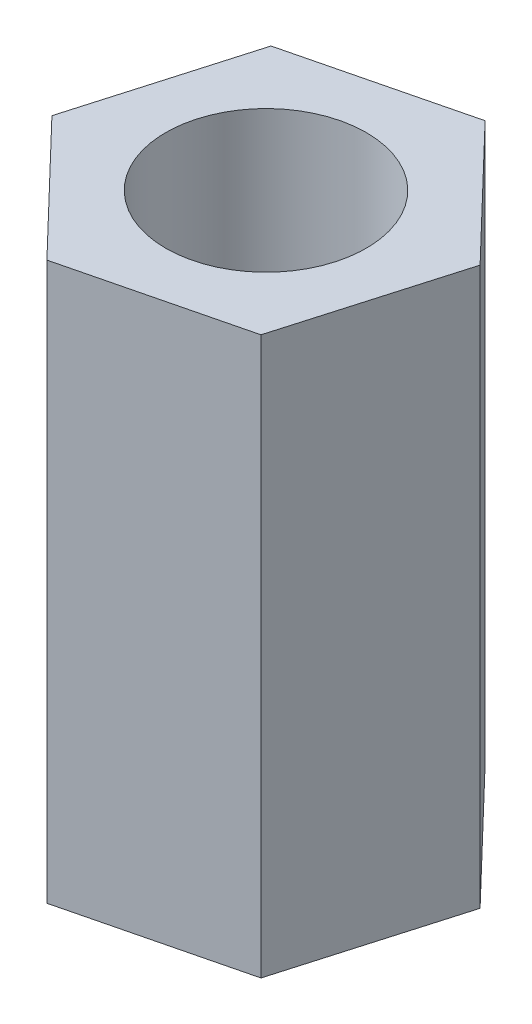
ISO-10303-21;
HEADER;
FILE_DESCRIPTION(('STEP AP214'),'2;1');
FILE_NAME('part.step','',(''),(''),'','','');
FILE_SCHEMA(('AUTOMOTIVE_DESIGN { 1 0 10303 214 1 1 1 1 }'));
ENDSEC;
DATA;
#1=APPLICATION_CONTEXT('core data for automotive mechanical design processes');
#2=APPLICATION_PROTOCOL_DEFINITION('international standard','automotive_design',2000,#1);
#3=PRODUCT_CONTEXT('',#1,'mechanical');
#4=PRODUCT('Part','Part','',(#3));
#5=PRODUCT_RELATED_PRODUCT_CATEGORY('part','',(#4));
#6=PRODUCT_DEFINITION_FORMATION('','',#4);
#7=PRODUCT_DEFINITION_CONTEXT('part definition',#1,'design');
#8=PRODUCT_DEFINITION('design','',#6,#7);
#9=PRODUCT_DEFINITION_SHAPE('','',#8);
#10=(LENGTH_UNIT() NAMED_UNIT(*) SI_UNIT(.MILLI.,.METRE.));
#11=(NAMED_UNIT(*) PLANE_ANGLE_UNIT() SI_UNIT($,.RADIAN.));
#12=(NAMED_UNIT(*) SI_UNIT($,.STERADIAN.) SOLID_ANGLE_UNIT());
#13=UNCERTAINTY_MEASURE_WITH_UNIT(LENGTH_MEASURE(1.E-05),#10,'distance_accuracy_value','');
#14=(GEOMETRIC_REPRESENTATION_CONTEXT(3) GLOBAL_UNCERTAINTY_ASSIGNED_CONTEXT((#13)) GLOBAL_UNIT_ASSIGNED_CONTEXT((#10,
#11,#12)) REPRESENTATION_CONTEXT('',''));
#15=CARTESIAN_POINT('',(0.,0.,0.));
#16=DIRECTION('',(0.,0.,1.));
#17=DIRECTION('',(1.,0.,0.));
#18=AXIS2_PLACEMENT_3D('',#15,#16,#17);
#19=CARTESIAN_POINT('',(0.,10.,0.));
#20=DIRECTION('',(0.,1.,0.));
#21=DIRECTION('',(0.,0.,1.));
#22=AXIS2_PLACEMENT_3D('',#19,#20,#21);
#23=PLANE('',#22);
#24=DIRECTION('',(0.970927267289887,0.,-0.239374688789339));
#25=VECTOR('',#24,1.);
#26=CARTESIAN_POINT('',(-0.883273683446069,10.,3.05010834782389));
#27=LINE('',#26,#25);
#28=CARTESIAN_POINT('',(-0.883273683446069,10.,3.05010834782389));
#29=VERTEX_POINT('',#28);
#30=CARTESIAN_POINT('',(2.19983447178743,10.,2.28999162227049));
#31=VERTEX_POINT('',#30);
#32=EDGE_CURVE('E129',#29,#31,#27,.T.);
#33=ORIENTED_EDGE('',*,*,#32,.T.);
#34=DIRECTION('',(0.278159072130381,0.,-0.960535023094715));
#35=VECTOR('',#34,1.);
#36=CARTESIAN_POINT('',(2.19983447178743,10.,2.28999162227049));
#37=LINE('',#36,#35);
#38=CARTESIAN_POINT('',(3.0831081552335,10.,-0.760116725553394));
#39=VERTEX_POINT('',#38);
#40=EDGE_CURVE('E87',#31,#39,#37,.T.);
#41=ORIENTED_EDGE('',*,*,#40,.T.);
#42=DIRECTION('',(-0.692768195159505,0.,-0.721160334305376));
#43=VECTOR('',#42,1.);
#44=CARTESIAN_POINT('',(3.0831081552335,10.,-0.760116725553394));
#45=LINE('',#44,#43);
#46=CARTESIAN_POINT('',(0.883273683446069,10.,-3.05010834782389));
#47=VERTEX_POINT('',#46);
#48=EDGE_CURVE('E100',#39,#47,#45,.T.);
#49=ORIENTED_EDGE('',*,*,#48,.T.);
#50=DIRECTION('',(-0.970927267289887,0.,0.239374688789339));
#51=VECTOR('',#50,1.);
#52=CARTESIAN_POINT('',(0.883273683446069,10.,-3.05010834782389));
#53=LINE('',#52,#51);
#54=CARTESIAN_POINT('',(-2.19983447178743,10.,-2.28999162227049));
#55=VERTEX_POINT('',#54);
#56=EDGE_CURVE('E94',#47,#55,#53,.T.);
#57=ORIENTED_EDGE('',*,*,#56,.T.);
#58=DIRECTION('',(-0.278159072130381,0.,0.960535023094715));
#59=VECTOR('',#58,1.);
#60=CARTESIAN_POINT('',(-2.19983447178743,10.,-2.28999162227049));
#61=LINE('',#60,#59);
#62=CARTESIAN_POINT('',(-3.0831081552335,10.,0.760116725553392));
#63=VERTEX_POINT('',#62);
#64=EDGE_CURVE('E98',#55,#63,#61,.T.);
#65=ORIENTED_EDGE('',*,*,#64,.T.);
#66=DIRECTION('',(0.692768195159505,0.,0.721160334305376));
#67=VECTOR('',#66,1.);
#68=CARTESIAN_POINT('',(-3.0831081552335,10.,0.760116725553392));
#69=LINE('',#68,#67);
#70=EDGE_CURVE('E50',#63,#29,#69,.T.);
#71=ORIENTED_EDGE('',*,*,#70,.T.);
#72=EDGE_LOOP('',(#33,#41,#49,#57,#65,#71));
#73=FACE_BOUND('',#72,.T.);
#74=CARTESIAN_POINT('',(0.,10.,0.));
#75=DIRECTION('',(0.,1.,0.));
#76=DIRECTION('',(0.,0.,1.));
#77=AXIS2_PLACEMENT_3D('',#74,#75,#76);
#78=CIRCLE('',#77,1.8);
#79=CARTESIAN_POINT('',(0.,10.,1.8));
#80=VERTEX_POINT('',#79);
#81=EDGE_CURVE('E122',#80,#80,#78,.T.);
#82=ORIENTED_EDGE('',*,*,#81,.F.);
#83=EDGE_LOOP('',(#82));
#84=FACE_BOUND('',#83,.T.);
#85=ADVANCED_FACE('F33',(#73,#84),#23,.T.);
#86=CARTESIAN_POINT('',(0.,0.,0.));
#87=DIRECTION('',(0.,1.,0.));
#88=DIRECTION('',(0.,0.,1.));
#89=AXIS2_PLACEMENT_3D('',#86,#87,#88);
#90=PLANE('',#89);
#91=DIRECTION('',(0.970927267289887,0.,-0.239374688789339));
#92=VECTOR('',#91,1.);
#93=CARTESIAN_POINT('',(-0.883273683446069,0.,3.05010834782389));
#94=LINE('',#93,#92);
#95=CARTESIAN_POINT('',(-0.883273683446069,0.,3.05010834782389));
#96=VERTEX_POINT('',#95);
#97=CARTESIAN_POINT('',(2.19983447178743,0.,2.28999162227049));
#98=VERTEX_POINT('',#97);
#99=EDGE_CURVE('E118',#96,#98,#94,.T.);
#100=ORIENTED_EDGE('',*,*,#99,.F.);
#101=DIRECTION('',(0.692768195159505,0.,0.721160334305376));
#102=VECTOR('',#101,1.);
#103=CARTESIAN_POINT('',(-3.0831081552335,0.,0.760116725553392));
#104=LINE('',#103,#102);
#105=CARTESIAN_POINT('',(-3.0831081552335,0.,0.760116725553392));
#106=VERTEX_POINT('',#105);
#107=EDGE_CURVE('E79',#106,#96,#104,.T.);
#108=ORIENTED_EDGE('',*,*,#107,.F.);
#109=DIRECTION('',(-0.278159072130381,0.,0.960535023094715));
#110=VECTOR('',#109,1.);
#111=CARTESIAN_POINT('',(-2.19983447178743,0.,-2.28999162227049));
#112=LINE('',#111,#110);
#113=CARTESIAN_POINT('',(-2.19983447178743,0.,-2.28999162227049));
#114=VERTEX_POINT('',#113);
#115=EDGE_CURVE('E73',#114,#106,#112,.T.);
#116=ORIENTED_EDGE('',*,*,#115,.F.);
#117=DIRECTION('',(-0.970927267289887,0.,0.239374688789339));
#118=VECTOR('',#117,1.);
#119=CARTESIAN_POINT('',(0.883273683446069,0.,-3.05010834782389));
#120=LINE('',#119,#118);
#121=CARTESIAN_POINT('',(0.883273683446069,0.,-3.05010834782389));
#122=VERTEX_POINT('',#121);
#123=EDGE_CURVE('E108',#122,#114,#120,.T.);
#124=ORIENTED_EDGE('',*,*,#123,.F.);
#125=DIRECTION('',(-0.692768195159505,0.,-0.721160334305376));
#126=VECTOR('',#125,1.);
#127=CARTESIAN_POINT('',(3.0831081552335,0.,-0.760116725553394));
#128=LINE('',#127,#126);
#129=CARTESIAN_POINT('',(3.0831081552335,0.,-0.760116725553394));
#130=VERTEX_POINT('',#129);
#131=EDGE_CURVE('E124',#130,#122,#128,.T.);
#132=ORIENTED_EDGE('',*,*,#131,.F.);
#133=DIRECTION('',(0.278159072130381,0.,-0.960535023094715));
#134=VECTOR('',#133,1.);
#135=CARTESIAN_POINT('',(2.19983447178743,0.,2.28999162227049));
#136=LINE('',#135,#134);
#137=EDGE_CURVE('E121',#98,#130,#136,.T.);
#138=ORIENTED_EDGE('',*,*,#137,.F.);
#139=EDGE_LOOP('',(#100,#108,#116,#124,#132,#138));
#140=FACE_BOUND('',#139,.T.);
#141=CARTESIAN_POINT('',(0.,0.,0.));
#142=DIRECTION('',(0.,1.,0.));
#143=DIRECTION('',(0.,0.,1.));
#144=AXIS2_PLACEMENT_3D('',#141,#142,#143);
#145=CIRCLE('',#144,1.8);
#146=CARTESIAN_POINT('',(0.,0.,1.8));
#147=VERTEX_POINT('',#146);
#148=EDGE_CURVE('E222',#147,#147,#145,.T.);
#149=ORIENTED_EDGE('',*,*,#148,.T.);
#150=EDGE_LOOP('',(#149));
#151=FACE_BOUND('',#150,.T.);
#152=ADVANCED_FACE('F138',(#140,#151),#90,.F.);
#153=CARTESIAN_POINT('',(-0.883273683446069,10.,3.05010834782389));
#154=DIRECTION('',(-0.239374688789339,0.,-0.970927267289887));
#155=DIRECTION('',(-0.970927267289887,0.,0.239374688789339));
#156=AXIS2_PLACEMENT_3D('',#153,#154,#155);
#157=PLANE('',#156);
#158=ORIENTED_EDGE('',*,*,#99,.T.);
#159=DIRECTION('',(0.,-1.,0.));
#160=VECTOR('',#159,1.);
#161=CARTESIAN_POINT('',(2.19983447178743,10.,2.28999162227049));
#162=LINE('',#161,#160);
#163=EDGE_CURVE('E11',#31,#98,#162,.T.);
#164=ORIENTED_EDGE('',*,*,#163,.F.);
#165=ORIENTED_EDGE('',*,*,#32,.F.);
#166=DIRECTION('',(0.,-1.,0.));
#167=VECTOR('',#166,1.);
#168=CARTESIAN_POINT('',(-0.883273683446069,10.,3.05010834782389));
#169=LINE('',#168,#167);
#170=EDGE_CURVE('E114',#29,#96,#169,.T.);
#171=ORIENTED_EDGE('',*,*,#170,.T.);
#172=EDGE_LOOP('',(#158,#164,#165,#171));
#173=FACE_BOUND('',#172,.T.);
#174=ADVANCED_FACE('F35',(#173),#157,.F.);
#175=CARTESIAN_POINT('',(2.19983447178743,10.,2.28999162227049));
#176=DIRECTION('',(-0.960535023094715,0.,-0.278159072130381));
#177=DIRECTION('',(-0.278159072130381,0.,0.960535023094715));
#178=AXIS2_PLACEMENT_3D('',#175,#176,#177);
#179=PLANE('',#178);
#180=ORIENTED_EDGE('',*,*,#137,.T.);
#181=DIRECTION('',(0.,-1.,0.));
#182=VECTOR('',#181,1.);
#183=CARTESIAN_POINT('',(3.0831081552335,10.,-0.760116725553394));
#184=LINE('',#183,#182);
#185=EDGE_CURVE('E42',#39,#130,#184,.T.);
#186=ORIENTED_EDGE('',*,*,#185,.F.);
#187=ORIENTED_EDGE('',*,*,#40,.F.);
#188=ORIENTED_EDGE('',*,*,#163,.T.);
#189=EDGE_LOOP('',(#180,#186,#187,#188));
#190=FACE_BOUND('',#189,.T.);
#191=ADVANCED_FACE('F163',(#190),#179,.F.);
#192=CARTESIAN_POINT('',(3.0831081552335,10.,-0.760116725553394));
#193=DIRECTION('',(-0.721160334305376,0.,0.692768195159505));
#194=DIRECTION('',(0.692768195159505,0.,0.721160334305376));
#195=AXIS2_PLACEMENT_3D('',#192,#193,#194);
#196=PLANE('',#195);
#197=ORIENTED_EDGE('',*,*,#131,.T.);
#198=DIRECTION('',(0.,-1.,0.));
#199=VECTOR('',#198,1.);
#200=CARTESIAN_POINT('',(0.883273683446069,10.,-3.05010834782389));
#201=LINE('',#200,#199);
#202=EDGE_CURVE('E109',#47,#122,#201,.T.);
#203=ORIENTED_EDGE('',*,*,#202,.F.);
#204=ORIENTED_EDGE('',*,*,#48,.F.);
#205=ORIENTED_EDGE('',*,*,#185,.T.);
#206=EDGE_LOOP('',(#197,#203,#204,#205));
#207=FACE_BOUND('',#206,.T.);
#208=ADVANCED_FACE('F135',(#207),#196,.F.);
#209=CARTESIAN_POINT('',(0.883273683446069,10.,-3.05010834782389));
#210=DIRECTION('',(0.239374688789339,0.,0.970927267289887));
#211=DIRECTION('',(0.970927267289887,0.,-0.239374688789339));
#212=AXIS2_PLACEMENT_3D('',#209,#210,#211);
#213=PLANE('',#212);
#214=ORIENTED_EDGE('',*,*,#123,.T.);
#215=DIRECTION('',(0.,-1.,0.));
#216=VECTOR('',#215,1.);
#217=CARTESIAN_POINT('',(-2.19983447178743,10.,-2.28999162227049));
#218=LINE('',#217,#216);
#219=EDGE_CURVE('E105',#55,#114,#218,.T.);
#220=ORIENTED_EDGE('',*,*,#219,.F.);
#221=ORIENTED_EDGE('',*,*,#56,.F.);
#222=ORIENTED_EDGE('',*,*,#202,.T.);
#223=EDGE_LOOP('',(#214,#220,#221,#222));
#224=FACE_BOUND('',#223,.T.);
#225=ADVANCED_FACE('F106',(#224),#213,.F.);
#226=CARTESIAN_POINT('',(-2.19983447178743,10.,-2.28999162227049));
#227=DIRECTION('',(0.960535023094715,0.,0.278159072130381));
#228=DIRECTION('',(0.278159072130381,0.,-0.960535023094715));
#229=AXIS2_PLACEMENT_3D('',#226,#227,#228);
#230=PLANE('',#229);
#231=ORIENTED_EDGE('',*,*,#115,.T.);
#232=DIRECTION('',(0.,-1.,0.));
#233=VECTOR('',#232,1.);
#234=CARTESIAN_POINT('',(-3.0831081552335,10.,0.760116725553392));
#235=LINE('',#234,#233);
#236=EDGE_CURVE('E110',#63,#106,#235,.T.);
#237=ORIENTED_EDGE('',*,*,#236,.F.);
#238=ORIENTED_EDGE('',*,*,#64,.F.);
#239=ORIENTED_EDGE('',*,*,#219,.T.);
#240=EDGE_LOOP('',(#231,#237,#238,#239));
#241=FACE_BOUND('',#240,.T.);
#242=ADVANCED_FACE('F112',(#241),#230,.F.);
#243=CARTESIAN_POINT('',(-3.0831081552335,10.,0.760116725553392));
#244=DIRECTION('',(0.721160334305376,0.,-0.692768195159505));
#245=DIRECTION('',(-0.692768195159505,0.,-0.721160334305376));
#246=AXIS2_PLACEMENT_3D('',#243,#244,#245);
#247=PLANE('',#246);
#248=ORIENTED_EDGE('',*,*,#107,.T.);
#249=ORIENTED_EDGE('',*,*,#170,.F.);
#250=ORIENTED_EDGE('',*,*,#70,.F.);
#251=ORIENTED_EDGE('',*,*,#236,.T.);
#252=EDGE_LOOP('',(#248,#249,#250,#251));
#253=FACE_BOUND('',#252,.T.);
#254=ADVANCED_FACE('F143',(#253),#247,.F.);
#255=CARTESIAN_POINT('',(0.,10.,0.));
#256=DIRECTION('',(0.,-1.,0.));
#257=DIRECTION('',(0.,0.,-1.));
#258=AXIS2_PLACEMENT_3D('',#255,#256,#257);
#259=CYLINDRICAL_SURFACE('',#258,1.8);
#260=ORIENTED_EDGE('',*,*,#81,.T.);
#261=EDGE_LOOP('',(#260));
#262=FACE_BOUND('',#261,.T.);
#263=ORIENTED_EDGE('',*,*,#148,.F.);
#264=EDGE_LOOP('',(#263));
#265=FACE_BOUND('',#264,.T.);
#266=ADVANCED_FACE('F145',(#262,#265),#259,.F.);
#267=CLOSED_SHELL('',(#85,#152,#174,#191,#208,#225,#242,#254,#266));
#268=MANIFOLD_SOLID_BREP('B2',#267);
#269=ADVANCED_BREP_SHAPE_REPRESENTATION('',(#18,#268),#14);
#270=SHAPE_DEFINITION_REPRESENTATION(#9,#269);
ENDSEC;
END-ISO-10303-21;
